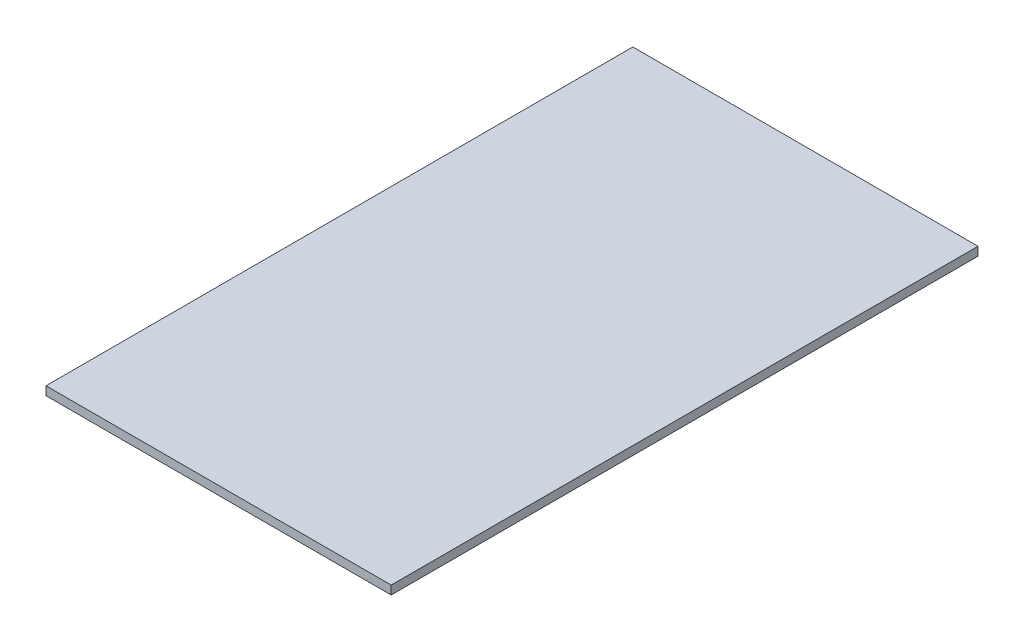
ISO-10303-21;
HEADER;
FILE_DESCRIPTION(('STEP AP214'),'2;1');
FILE_NAME('part.step','',(''),(''),'','','');
FILE_SCHEMA(('AUTOMOTIVE_DESIGN { 1 0 10303 214 1 1 1 1 }'));
ENDSEC;
DATA;
#1=APPLICATION_CONTEXT('core data for automotive mechanical design processes');
#2=APPLICATION_PROTOCOL_DEFINITION('international standard','automotive_design',2000,#1);
#3=PRODUCT_CONTEXT('',#1,'mechanical');
#4=PRODUCT('Part','Part','',(#3));
#5=PRODUCT_RELATED_PRODUCT_CATEGORY('part','',(#4));
#6=PRODUCT_DEFINITION_FORMATION('','',#4);
#7=PRODUCT_DEFINITION_CONTEXT('part definition',#1,'design');
#8=PRODUCT_DEFINITION('design','',#6,#7);
#9=PRODUCT_DEFINITION_SHAPE('','',#8);
#10=(LENGTH_UNIT() NAMED_UNIT(*) SI_UNIT(.MILLI.,.METRE.));
#11=(NAMED_UNIT(*) PLANE_ANGLE_UNIT() SI_UNIT($,.RADIAN.));
#12=(NAMED_UNIT(*) SI_UNIT($,.STERADIAN.) SOLID_ANGLE_UNIT());
#13=UNCERTAINTY_MEASURE_WITH_UNIT(LENGTH_MEASURE(1.E-05),#10,'distance_accuracy_value','');
#14=(GEOMETRIC_REPRESENTATION_CONTEXT(3) GLOBAL_UNCERTAINTY_ASSIGNED_CONTEXT((#13)) GLOBAL_UNIT_ASSIGNED_CONTEXT((#10,
#11,#12)) REPRESENTATION_CONTEXT('',''));
#15=CARTESIAN_POINT('',(0.,0.,0.));
#16=DIRECTION('',(0.,0.,1.));
#17=DIRECTION('',(1.,0.,0.));
#18=AXIS2_PLACEMENT_3D('',#15,#16,#17);
#19=CARTESIAN_POINT('',(0.,3.175,0.));
#20=DIRECTION('',(1.,0.,0.));
#21=DIRECTION('',(0.,0.,-1.));
#22=AXIS2_PLACEMENT_3D('',#19,#20,#21);
#23=PLANE('',#22);
#24=DIRECTION('',(0.,0.,1.));
#25=VECTOR('',#24,1.);
#26=CARTESIAN_POINT('',(0.,0.,0.));
#27=LINE('',#26,#25);
#28=CARTESIAN_POINT('',(0.,0.,-215.9));
#29=VERTEX_POINT('',#28);
#30=CARTESIAN_POINT('',(0.,0.,0.));
#31=VERTEX_POINT('',#30);
#32=EDGE_CURVE('E96',#29,#31,#27,.T.);
#33=ORIENTED_EDGE('',*,*,#32,.T.);
#34=DIRECTION('',(0.,-1.,0.));
#35=VECTOR('',#34,1.);
#36=CARTESIAN_POINT('',(0.,3.175,0.));
#37=LINE('',#36,#35);
#38=CARTESIAN_POINT('',(0.,3.175,0.));
#39=VERTEX_POINT('',#38);
#40=EDGE_CURVE('E11',#39,#31,#37,.T.);
#41=ORIENTED_EDGE('',*,*,#40,.F.);
#42=DIRECTION('',(0.,0.,1.));
#43=VECTOR('',#42,1.);
#44=CARTESIAN_POINT('',(0.,3.175,0.));
#45=LINE('',#44,#43);
#46=CARTESIAN_POINT('',(0.,3.175,-215.9));
#47=VERTEX_POINT('',#46);
#48=EDGE_CURVE('E84',#47,#39,#45,.T.);
#49=ORIENTED_EDGE('',*,*,#48,.F.);
#50=DIRECTION('',(0.,-1.,0.));
#51=VECTOR('',#50,1.);
#52=CARTESIAN_POINT('',(0.,3.175,-215.9));
#53=LINE('',#52,#51);
#54=EDGE_CURVE('E92',#47,#29,#53,.T.);
#55=ORIENTED_EDGE('',*,*,#54,.T.);
#56=EDGE_LOOP('',(#33,#41,#49,#55));
#57=FACE_BOUND('',#56,.T.);
#58=ADVANCED_FACE('F33',(#57),#23,.F.);
#59=CARTESIAN_POINT('',(0.,3.175,0.));
#60=DIRECTION('',(0.,0.,-1.));
#61=DIRECTION('',(-1.,0.,0.));
#62=AXIS2_PLACEMENT_3D('',#59,#60,#61);
#63=PLANE('',#62);
#64=DIRECTION('',(1.,0.,0.));
#65=VECTOR('',#64,1.);
#66=CARTESIAN_POINT('',(0.,0.,0.));
#67=LINE('',#66,#65);
#68=CARTESIAN_POINT('',(127.,0.,0.));
#69=VERTEX_POINT('',#68);
#70=EDGE_CURVE('E88',#31,#69,#67,.T.);
#71=ORIENTED_EDGE('',*,*,#70,.T.);
#72=DIRECTION('',(0.,-1.,0.));
#73=VECTOR('',#72,1.);
#74=CARTESIAN_POINT('',(127.,3.175,0.));
#75=LINE('',#74,#73);
#76=CARTESIAN_POINT('',(127.,3.175,0.));
#77=VERTEX_POINT('',#76);
#78=EDGE_CURVE('E41',#77,#69,#75,.T.);
#79=ORIENTED_EDGE('',*,*,#78,.F.);
#80=DIRECTION('',(1.,0.,0.));
#81=VECTOR('',#80,1.);
#82=CARTESIAN_POINT('',(0.,3.175,0.));
#83=LINE('',#82,#81);
#84=EDGE_CURVE('E79',#39,#77,#83,.T.);
#85=ORIENTED_EDGE('',*,*,#84,.F.);
#86=ORIENTED_EDGE('',*,*,#40,.T.);
#87=EDGE_LOOP('',(#71,#79,#85,#86));
#88=FACE_BOUND('',#87,.T.);
#89=ADVANCED_FACE('F87',(#88),#63,.F.);
#90=CARTESIAN_POINT('',(127.,3.175,0.));
#91=DIRECTION('',(-1.,0.,0.));
#92=DIRECTION('',(0.,0.,1.));
#93=AXIS2_PLACEMENT_3D('',#90,#91,#92);
#94=PLANE('',#93);
#95=DIRECTION('',(0.,0.,-1.));
#96=VECTOR('',#95,1.);
#97=CARTESIAN_POINT('',(127.,0.,0.));
#98=LINE('',#97,#96);
#99=CARTESIAN_POINT('',(127.,0.,-215.9));
#100=VERTEX_POINT('',#99);
#101=EDGE_CURVE('E66',#69,#100,#98,.T.);
#102=ORIENTED_EDGE('',*,*,#101,.T.);
#103=DIRECTION('',(0.,-1.,0.));
#104=VECTOR('',#103,1.);
#105=CARTESIAN_POINT('',(127.,3.175,-215.9));
#106=LINE('',#105,#104);
#107=CARTESIAN_POINT('',(127.,3.175,-215.9));
#108=VERTEX_POINT('',#107);
#109=EDGE_CURVE('E89',#108,#100,#106,.T.);
#110=ORIENTED_EDGE('',*,*,#109,.F.);
#111=DIRECTION('',(0.,0.,-1.));
#112=VECTOR('',#111,1.);
#113=CARTESIAN_POINT('',(127.,3.175,0.));
#114=LINE('',#113,#112);
#115=EDGE_CURVE('E82',#77,#108,#114,.T.);
#116=ORIENTED_EDGE('',*,*,#115,.F.);
#117=ORIENTED_EDGE('',*,*,#78,.T.);
#118=EDGE_LOOP('',(#102,#110,#116,#117));
#119=FACE_BOUND('',#118,.T.);
#120=ADVANCED_FACE('F90',(#119),#94,.F.);
#121=CARTESIAN_POINT('',(0.,3.175,-215.9));
#122=DIRECTION('',(0.,0.,1.));
#123=DIRECTION('',(1.,0.,0.));
#124=AXIS2_PLACEMENT_3D('',#121,#122,#123);
#125=PLANE('',#124);
#126=DIRECTION('',(-1.,0.,0.));
#127=VECTOR('',#126,1.);
#128=CARTESIAN_POINT('',(0.,0.,-215.9));
#129=LINE('',#128,#127);
#130=EDGE_CURVE('E72',#100,#29,#129,.T.);
#131=ORIENTED_EDGE('',*,*,#130,.T.);
#132=ORIENTED_EDGE('',*,*,#54,.F.);
#133=DIRECTION('',(-1.,0.,0.));
#134=VECTOR('',#133,1.);
#135=CARTESIAN_POINT('',(0.,3.175,-215.9));
#136=LINE('',#135,#134);
#137=EDGE_CURVE('E49',#108,#47,#136,.T.);
#138=ORIENTED_EDGE('',*,*,#137,.F.);
#139=ORIENTED_EDGE('',*,*,#109,.T.);
#140=EDGE_LOOP('',(#131,#132,#138,#139));
#141=FACE_BOUND('',#140,.T.);
#142=ADVANCED_FACE('F103',(#141),#125,.F.);
#143=CARTESIAN_POINT('',(0.,3.175,0.));
#144=DIRECTION('',(0.,-1.,0.));
#145=DIRECTION('',(0.,0.,-1.));
#146=AXIS2_PLACEMENT_3D('',#143,#144,#145);
#147=PLANE('',#146);
#148=ORIENTED_EDGE('',*,*,#48,.T.);
#149=ORIENTED_EDGE('',*,*,#84,.T.);
#150=ORIENTED_EDGE('',*,*,#115,.T.);
#151=ORIENTED_EDGE('',*,*,#137,.T.);
#152=EDGE_LOOP('',(#148,#149,#150,#151));
#153=FACE_BOUND('',#152,.T.);
#154=ADVANCED_FACE('F80',(#153),#147,.F.);
#155=CARTESIAN_POINT('',(0.,0.,0.));
#156=DIRECTION('',(0.,-1.,0.));
#157=DIRECTION('',(0.,0.,-1.));
#158=AXIS2_PLACEMENT_3D('',#155,#156,#157);
#159=PLANE('',#158);
#160=ORIENTED_EDGE('',*,*,#32,.F.);
#161=ORIENTED_EDGE('',*,*,#130,.F.);
#162=ORIENTED_EDGE('',*,*,#101,.F.);
#163=ORIENTED_EDGE('',*,*,#70,.F.);
#164=EDGE_LOOP('',(#160,#161,#162,#163));
#165=FACE_BOUND('',#164,.T.);
#166=ADVANCED_FACE('F106',(#165),#159,.T.);
#167=CLOSED_SHELL('',(#58,#89,#120,#142,#154,#166));
#168=MANIFOLD_SOLID_BREP('B2',#167);
#169=ADVANCED_BREP_SHAPE_REPRESENTATION('',(#18,#168),#14);
#170=SHAPE_DEFINITION_REPRESENTATION(#9,#169);
ENDSEC;
END-ISO-10303-21;
